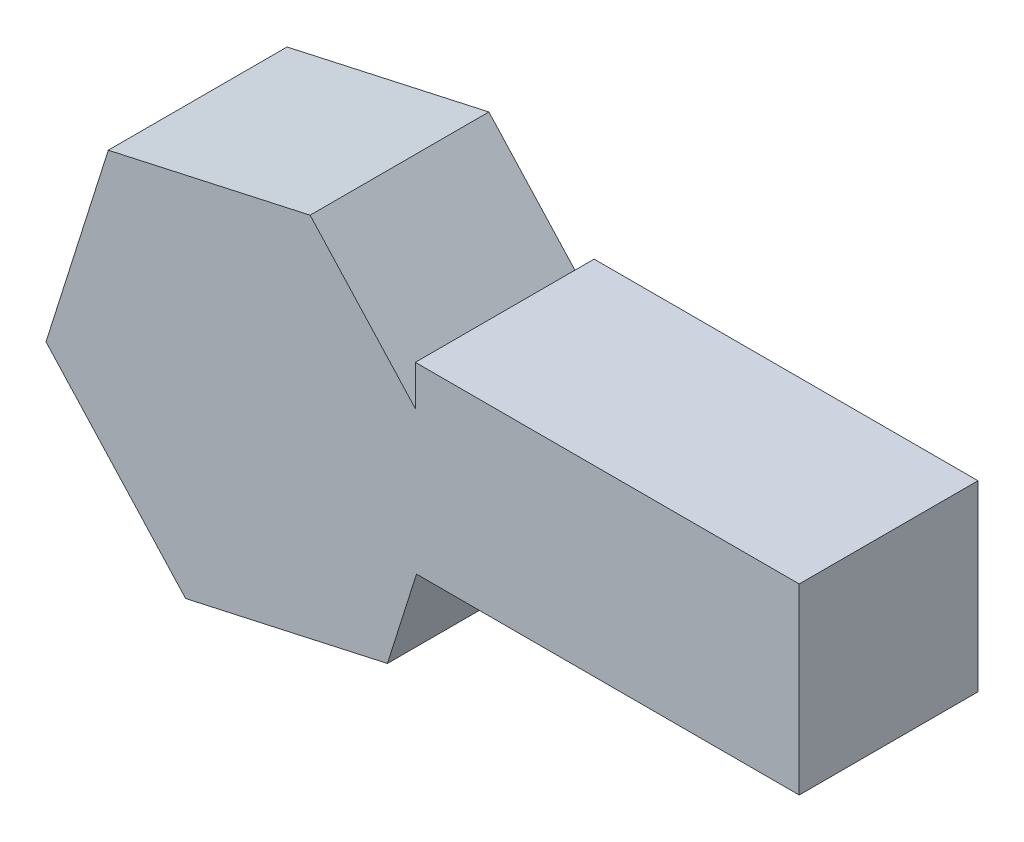
ISO-10303-21;
HEADER;
FILE_DESCRIPTION(('STEP AP214'),'2;1');
FILE_NAME('part.step','',(''),(''),'','','');
FILE_SCHEMA(('AUTOMOTIVE_DESIGN { 1 0 10303 214 1 1 1 1 }'));
ENDSEC;
DATA;
#1=APPLICATION_CONTEXT('core data for automotive mechanical design processes');
#2=APPLICATION_PROTOCOL_DEFINITION('international standard','automotive_design',2000,#1);
#3=PRODUCT_CONTEXT('',#1,'mechanical');
#4=PRODUCT('Part','Part','',(#3));
#5=PRODUCT_RELATED_PRODUCT_CATEGORY('part','',(#4));
#6=PRODUCT_DEFINITION_FORMATION('','',#4);
#7=PRODUCT_DEFINITION_CONTEXT('part definition',#1,'design');
#8=PRODUCT_DEFINITION('design','',#6,#7);
#9=PRODUCT_DEFINITION_SHAPE('','',#8);
#10=(LENGTH_UNIT() NAMED_UNIT(*) SI_UNIT(.MILLI.,.METRE.));
#11=(NAMED_UNIT(*) PLANE_ANGLE_UNIT() SI_UNIT($,.RADIAN.));
#12=(NAMED_UNIT(*) SI_UNIT($,.STERADIAN.) SOLID_ANGLE_UNIT());
#13=UNCERTAINTY_MEASURE_WITH_UNIT(LENGTH_MEASURE(1.E-05),#10,'distance_accuracy_value','');
#14=(GEOMETRIC_REPRESENTATION_CONTEXT(3) GLOBAL_UNCERTAINTY_ASSIGNED_CONTEXT((#13)) GLOBAL_UNIT_ASSIGNED_CONTEXT((#10,
#11,#12)) REPRESENTATION_CONTEXT('',''));
#15=CARTESIAN_POINT('',(0.,0.,0.));
#16=DIRECTION('',(0.,0.,1.));
#17=DIRECTION('',(1.,0.,0.));
#18=AXIS2_PLACEMENT_3D('',#15,#16,#17);
#19=CARTESIAN_POINT('',(-85.7610498689514,27.0933166128518,123.952));
#20=DIRECTION('',(-0.953547922120265,0.301241365386834,0.));
#21=DIRECTION('',(-0.301241365386834,-0.953547922120266,0.));
#22=AXIS2_PLACEMENT_3D('',#19,#20,#21);
#23=PLANE('',#22);
#24=DIRECTION('',(0.301241365386834,0.953547922120265,0.));
#25=VECTOR('',#24,1.);
#26=CARTESIAN_POINT('',(-85.7610498689514,27.0933166128518,0.));
#27=LINE('',#26,#25);
#28=CARTESIAN_POINT('',(-134.237307201379,-126.353187628506,0.));
#29=VERTEX_POINT('',#28);
#30=CARTESIAN_POINT('',(-114.091291890467,-62.5830908024787,0.));
#31=VERTEX_POINT('',#30);
#32=EDGE_CURVE('E145',#29,#31,#27,.T.);
#33=ORIENTED_EDGE('',*,*,#32,.T.);
#34=DIRECTION('',(0.,0.,-1.));
#35=VECTOR('',#34,1.);
#36=CARTESIAN_POINT('',(-114.091291890467,-62.5830908024787,123.952));
#37=LINE('',#36,#35);
#38=CARTESIAN_POINT('',(-114.091291890467,-62.5830908024787,123.952));
#39=VERTEX_POINT('',#38);
#40=EDGE_CURVE('E11',#39,#31,#37,.T.);
#41=ORIENTED_EDGE('',*,*,#40,.F.);
#42=DIRECTION('',(0.301241365386834,0.953547922120265,0.));
#43=VECTOR('',#42,1.);
#44=CARTESIAN_POINT('',(-85.7610498689514,27.0933166128518,123.952));
#45=LINE('',#44,#43);
#46=CARTESIAN_POINT('',(-134.237307201379,-126.353187628506,123.952));
#47=VERTEX_POINT('',#46);
#48=EDGE_CURVE('E166',#47,#39,#45,.T.);
#49=ORIENTED_EDGE('',*,*,#48,.F.);
#50=DIRECTION('',(0.,0.,-1.));
#51=VECTOR('',#50,1.);
#52=CARTESIAN_POINT('',(-134.237307201379,-126.353187628506,123.952));
#53=LINE('',#52,#51);
#54=EDGE_CURVE('E141',#47,#29,#53,.T.);
#55=ORIENTED_EDGE('',*,*,#54,.T.);
#56=EDGE_LOOP('',(#33,#41,#49,#55));
#57=FACE_BOUND('',#56,.T.);
#58=ADVANCED_FACE('F37',(#57),#23,.F.);
#59=CARTESIAN_POINT('',(0.,-62.5830908024787,123.952));
#60=DIRECTION('',(0.,1.,0.));
#61=DIRECTION('',(0.,0.,1.));
#62=AXIS2_PLACEMENT_3D('',#59,#60,#61);
#63=PLANE('',#62);
#64=DIRECTION('',(1.,0.,0.));
#65=VECTOR('',#64,1.);
#66=CARTESIAN_POINT('',(0.,-62.5830908024787,0.));
#67=LINE('',#66,#65);
#68=CARTESIAN_POINT('',(151.26718629983,-62.5830908024787,0.));
#69=VERTEX_POINT('',#68);
#70=EDGE_CURVE('E148',#31,#69,#67,.T.);
#71=ORIENTED_EDGE('',*,*,#70,.T.);
#72=DIRECTION('',(0.,0.,-1.));
#73=VECTOR('',#72,1.);
#74=CARTESIAN_POINT('',(151.26718629983,-62.5830908024787,123.952));
#75=LINE('',#74,#73);
#76=CARTESIAN_POINT('',(151.26718629983,-62.5830908024787,123.952));
#77=VERTEX_POINT('',#76);
#78=EDGE_CURVE('E45',#77,#69,#75,.T.);
#79=ORIENTED_EDGE('',*,*,#78,.F.);
#80=DIRECTION('',(1.,0.,0.));
#81=VECTOR('',#80,1.);
#82=CARTESIAN_POINT('',(0.,-62.5830908024787,123.952));
#83=LINE('',#82,#81);
#84=EDGE_CURVE('E102',#39,#77,#83,.T.);
#85=ORIENTED_EDGE('',*,*,#84,.F.);
#86=ORIENTED_EDGE('',*,*,#40,.T.);
#87=EDGE_LOOP('',(#71,#79,#85,#86));
#88=FACE_BOUND('',#87,.T.);
#89=ADVANCED_FACE('F185',(#88),#63,.F.);
#90=CARTESIAN_POINT('',(151.26718629983,0.,123.952));
#91=DIRECTION('',(1.,0.,0.));
#92=DIRECTION('',(0.,0.,-1.));
#93=AXIS2_PLACEMENT_3D('',#90,#91,#92);
#94=PLANE('',#93);
#95=DIRECTION('',(0.,-1.,0.));
#96=VECTOR('',#95,1.);
#97=CARTESIAN_POINT('',(151.26718629983,0.,0.));
#98=LINE('',#97,#96);
#99=CARTESIAN_POINT('',(151.26718629983,64.1649698748952,0.));
#100=VERTEX_POINT('',#99);
#101=EDGE_CURVE('E151',#100,#69,#98,.T.);
#102=ORIENTED_EDGE('',*,*,#101,.F.);
#103=DIRECTION('',(0.,0.,-1.));
#104=VECTOR('',#103,1.);
#105=CARTESIAN_POINT('',(151.26718629983,64.1649698748952,123.952));
#106=LINE('',#105,#104);
#107=CARTESIAN_POINT('',(151.26718629983,64.1649698748952,123.952));
#108=VERTEX_POINT('',#107);
#109=EDGE_CURVE('E178',#108,#100,#106,.T.);
#110=ORIENTED_EDGE('',*,*,#109,.F.);
#111=DIRECTION('',(0.,-1.,0.));
#112=VECTOR('',#111,1.);
#113=CARTESIAN_POINT('',(151.26718629983,0.,123.952));
#114=LINE('',#113,#112);
#115=EDGE_CURVE('E184',#108,#77,#114,.T.);
#116=ORIENTED_EDGE('',*,*,#115,.T.);
#117=ORIENTED_EDGE('',*,*,#78,.T.);
#118=EDGE_LOOP('',(#102,#110,#116,#117));
#119=FACE_BOUND('',#118,.T.);
#120=ADVANCED_FACE('F182',(#119),#94,.T.);
#121=CARTESIAN_POINT('',(0.,64.1649698748952,123.952));
#122=DIRECTION('',(0.,1.,0.));
#123=DIRECTION('',(0.,0.,1.));
#124=AXIS2_PLACEMENT_3D('',#121,#122,#123);
#125=PLANE('',#124);
#126=DIRECTION('',(1.,0.,0.));
#127=VECTOR('',#126,1.);
#128=CARTESIAN_POINT('',(0.,64.1649698748952,0.));
#129=LINE('',#128,#127);
#130=CARTESIAN_POINT('',(-114.88396763425,64.1649698748952,0.));
#131=VERTEX_POINT('',#130);
#132=EDGE_CURVE('E154',#131,#100,#129,.T.);
#133=ORIENTED_EDGE('',*,*,#132,.F.);
#134=DIRECTION('',(0.,0.,-1.));
#135=VECTOR('',#134,1.);
#136=CARTESIAN_POINT('',(-114.88396763425,64.1649698748952,123.952));
#137=LINE('',#136,#135);
#138=CARTESIAN_POINT('',(-114.88396763425,64.1649698748952,123.952));
#139=VERTEX_POINT('',#138);
#140=EDGE_CURVE('E176',#139,#131,#137,.T.);
#141=ORIENTED_EDGE('',*,*,#140,.F.);
#142=DIRECTION('',(1.,0.,0.));
#143=VECTOR('',#142,1.);
#144=CARTESIAN_POINT('',(0.,64.1649698748952,123.952));
#145=LINE('',#144,#143);
#146=EDGE_CURVE('E198',#139,#108,#145,.T.);
#147=ORIENTED_EDGE('',*,*,#146,.T.);
#148=ORIENTED_EDGE('',*,*,#109,.T.);
#149=EDGE_LOOP('',(#133,#141,#147,#148));
#150=FACE_BOUND('',#149,.T.);
#151=ADVANCED_FACE('F194',(#150),#125,.T.);
#152=CARTESIAN_POINT('',(-114.88396763425,0.,123.952));
#153=DIRECTION('',(1.,0.,0.));
#154=DIRECTION('',(0.,0.,-1.));
#155=AXIS2_PLACEMENT_3D('',#152,#153,#154);
#156=PLANE('',#155);
#157=DIRECTION('',(0.,-1.,0.));
#158=VECTOR('',#157,1.);
#159=CARTESIAN_POINT('',(-114.88396763425,0.,0.));
#160=LINE('',#159,#158);
#161=CARTESIAN_POINT('',(-114.88396763425,36.33988285761,0.));
#162=VERTEX_POINT('',#161);
#163=EDGE_CURVE('E157',#131,#162,#160,.T.);
#164=ORIENTED_EDGE('',*,*,#163,.T.);
#165=DIRECTION('',(0.,0.,-1.));
#166=VECTOR('',#165,1.);
#167=CARTESIAN_POINT('',(-114.88396763425,36.33988285761,123.952));
#168=LINE('',#167,#166);
#169=CARTESIAN_POINT('',(-114.88396763425,36.33988285761,123.952));
#170=VERTEX_POINT('',#169);
#171=EDGE_CURVE('E173',#170,#162,#168,.T.);
#172=ORIENTED_EDGE('',*,*,#171,.F.);
#173=DIRECTION('',(0.,-1.,0.));
#174=VECTOR('',#173,1.);
#175=CARTESIAN_POINT('',(-114.88396763425,0.,123.952));
#176=LINE('',#175,#174);
#177=EDGE_CURVE('E200',#139,#170,#176,.T.);
#178=ORIENTED_EDGE('',*,*,#177,.F.);
#179=ORIENTED_EDGE('',*,*,#140,.T.);
#180=EDGE_LOOP('',(#164,#172,#178,#179));
#181=FACE_BOUND('',#180,.T.);
#182=ADVANCED_FACE('F238',(#181),#156,.F.);
#183=CARTESIAN_POINT('',(-44.4136442770384,-40.6517437323774,123.952));
#184=DIRECTION('',(-0.737656636155842,-0.675176041588598,0.));
#185=DIRECTION('',(0.675176041588598,-0.737656636155842,0.));
#186=AXIS2_PLACEMENT_3D('',#183,#184,#185);
#187=PLANE('',#186);
#188=DIRECTION('',(-0.675176041588598,0.737656636155842,0.));
#189=VECTOR('',#188,1.);
#190=CARTESIAN_POINT('',(-44.4136442770384,-40.6517437323774,0.));
#191=LINE('',#190,#189);
#192=CARTESIAN_POINT('',(-187.831275188932,116.037713042468,0.));
#193=VERTEX_POINT('',#192);
#194=EDGE_CURVE('E159',#162,#193,#191,.T.);
#195=ORIENTED_EDGE('',*,*,#194,.T.);
#196=DIRECTION('',(0.,0.,-1.));
#197=VECTOR('',#196,1.);
#198=CARTESIAN_POINT('',(-187.831275188932,116.037713042468,123.952));
#199=LINE('',#198,#197);
#200=CARTESIAN_POINT('',(-187.831275188932,116.037713042468,123.952));
#201=VERTEX_POINT('',#200);
#202=EDGE_CURVE('E170',#201,#193,#199,.T.);
#203=ORIENTED_EDGE('',*,*,#202,.F.);
#204=DIRECTION('',(-0.675176041588598,0.737656636155842,0.));
#205=VECTOR('',#204,1.);
#206=CARTESIAN_POINT('',(-44.4136442770384,-40.6517437323774,123.952));
#207=LINE('',#206,#205);
#208=EDGE_CURVE('E206',#170,#201,#207,.T.);
#209=ORIENTED_EDGE('',*,*,#208,.F.);
#210=ORIENTED_EDGE('',*,*,#171,.T.);
#211=EDGE_LOOP('',(#195,#203,#209,#210));
#212=FACE_BOUND('',#211,.T.);
#213=ADVANCED_FACE('F211',(#212),#187,.F.);
#214=CARTESIAN_POINT('',(-33.2153878268933,150.2241403989,123.952));
#215=DIRECTION('',(0.215891285964423,-0.976417406975433,0.));
#216=DIRECTION('',(0.976417406975433,0.215891285964423,0.));
#217=AXIS2_PLACEMENT_3D('',#214,#215,#216);
#218=PLANE('',#217);
#219=DIRECTION('',(-0.976417406975433,-0.215891285964423,0.));
#220=VECTOR('',#219,1.);
#221=CARTESIAN_POINT('',(-33.2153878268933,150.2241403989,0.));
#222=LINE('',#221,#220);
#223=CARTESIAN_POINT('',(-327.775726940435,85.0952211979137,0.));
#224=VERTEX_POINT('',#223);
#225=EDGE_CURVE('E161',#193,#224,#222,.T.);
#226=ORIENTED_EDGE('',*,*,#225,.T.);
#227=DIRECTION('',(0.,0.,-1.));
#228=VECTOR('',#227,1.);
#229=CARTESIAN_POINT('',(-327.775726940435,85.0952211979137,123.952));
#230=LINE('',#229,#228);
#231=CARTESIAN_POINT('',(-327.775726940435,85.0952211979137,123.952));
#232=VERTEX_POINT('',#231);
#233=EDGE_CURVE('E136',#232,#224,#230,.T.);
#234=ORIENTED_EDGE('',*,*,#233,.F.);
#235=DIRECTION('',(-0.976417406975433,-0.215891285964423,0.));
#236=VECTOR('',#235,1.);
#237=CARTESIAN_POINT('',(-33.2153878268933,150.2241403989,123.952));
#238=LINE('',#237,#236);
#239=EDGE_CURVE('E127',#201,#232,#238,.T.);
#240=ORIENTED_EDGE('',*,*,#239,.F.);
#241=ORIENTED_EDGE('',*,*,#202,.T.);
#242=EDGE_LOOP('',(#226,#234,#240,#241));
#243=FACE_BOUND('',#242,.T.);
#244=ADVANCED_FACE('F214',(#243),#218,.F.);
#245=CARTESIAN_POINT('',(-322.474711489982,101.875029181508,123.952));
#246=DIRECTION('',(0.953547922120265,-0.301241365386836,0.));
#247=DIRECTION('',(0.301241365386836,0.953547922120265,0.));
#248=AXIS2_PLACEMENT_3D('',#245,#246,#247);
#249=PLANE('',#248);
#250=DIRECTION('',(-0.301241365386836,-0.953547922120265,0.));
#251=VECTOR('',#250,1.);
#252=CARTESIAN_POINT('',(-322.474711489982,101.875029181508,0.));
#253=LINE('',#252,#251);
#254=CARTESIAN_POINT('',(-370.95096882241,-51.5714750598505,0.));
#255=VERTEX_POINT('',#254);
#256=EDGE_CURVE('E135',#224,#255,#253,.T.);
#257=ORIENTED_EDGE('',*,*,#256,.T.);
#258=DIRECTION('',(0.,0.,-1.));
#259=VECTOR('',#258,1.);
#260=CARTESIAN_POINT('',(-370.95096882241,-51.5714750598505,123.952));
#261=LINE('',#260,#259);
#262=CARTESIAN_POINT('',(-370.95096882241,-51.5714750598505,123.952));
#263=VERTEX_POINT('',#262);
#264=EDGE_CURVE('E132',#263,#255,#261,.T.);
#265=ORIENTED_EDGE('',*,*,#264,.F.);
#266=DIRECTION('',(-0.301241365386836,-0.953547922120265,0.));
#267=VECTOR('',#266,1.);
#268=CARTESIAN_POINT('',(-322.474711489982,101.875029181508,123.952));
#269=LINE('',#268,#267);
#270=EDGE_CURVE('E121',#232,#263,#269,.T.);
#271=ORIENTED_EDGE('',*,*,#270,.F.);
#272=ORIENTED_EDGE('',*,*,#233,.T.);
#273=EDGE_LOOP('',(#257,#265,#271,#272));
#274=FACE_BOUND('',#273,.T.);
#275=ADVANCED_FACE('F133',(#274),#249,.F.);
#276=CARTESIAN_POINT('',(-227.533337910516,-208.260931834696,123.952));
#277=DIRECTION('',(0.737656636155843,0.675176041588597,0.));
#278=DIRECTION('',(-0.675176041588597,0.737656636155843,0.));
#279=AXIS2_PLACEMENT_3D('',#276,#277,#278);
#280=PLANE('',#279);
#281=DIRECTION('',(0.675176041588597,-0.737656636155843,0.));
#282=VECTOR('',#281,1.);
#283=CARTESIAN_POINT('',(-227.533337910516,-208.260931834696,0.));
#284=LINE('',#283,#282);
#285=CARTESIAN_POINT('',(-274.181758952882,-157.295679473061,0.));
#286=VERTEX_POINT('',#285);
#287=EDGE_CURVE('E88',#255,#286,#284,.T.);
#288=ORIENTED_EDGE('',*,*,#287,.T.);
#289=DIRECTION('',(0.,0.,-1.));
#290=VECTOR('',#289,1.);
#291=CARTESIAN_POINT('',(-274.181758952882,-157.295679473061,123.952));
#292=LINE('',#291,#290);
#293=CARTESIAN_POINT('',(-274.181758952882,-157.295679473061,123.952));
#294=VERTEX_POINT('',#293);
#295=EDGE_CURVE('E137',#294,#286,#292,.T.);
#296=ORIENTED_EDGE('',*,*,#295,.F.);
#297=DIRECTION('',(0.675176041588597,-0.737656636155843,0.));
#298=VECTOR('',#297,1.);
#299=CARTESIAN_POINT('',(-227.533337910516,-208.260931834696,123.952));
#300=LINE('',#299,#298);
#301=EDGE_CURVE('E125',#263,#294,#300,.T.);
#302=ORIENTED_EDGE('',*,*,#301,.F.);
#303=ORIENTED_EDGE('',*,*,#264,.T.);
#304=EDGE_LOOP('',(#288,#296,#302,#303));
#305=FACE_BOUND('',#304,.T.);
#306=ADVANCED_FACE('F139',(#305),#280,.F.);
#307=CARTESIAN_POINT('',(20.3785801606603,-92.1667602720747,123.952));
#308=DIRECTION('',(-0.215891285964423,0.976417406975433,0.));
#309=DIRECTION('',(-0.976417406975433,-0.215891285964423,0.));
#310=AXIS2_PLACEMENT_3D('',#307,#308,#309);
#311=PLANE('',#310);
#312=DIRECTION('',(0.976417406975433,0.215891285964423,0.));
#313=VECTOR('',#312,1.);
#314=CARTESIAN_POINT('',(20.3785801606603,-92.1667602720747,0.));
#315=LINE('',#314,#313);
#316=EDGE_CURVE('E94',#286,#29,#315,.T.);
#317=ORIENTED_EDGE('',*,*,#316,.T.);
#318=ORIENTED_EDGE('',*,*,#54,.F.);
#319=DIRECTION('',(0.976417406975433,0.215891285964423,0.));
#320=VECTOR('',#319,1.);
#321=CARTESIAN_POINT('',(20.3785801606603,-92.1667602720747,123.952));
#322=LINE('',#321,#320);
#323=EDGE_CURVE('E53',#294,#47,#322,.T.);
#324=ORIENTED_EDGE('',*,*,#323,.F.);
#325=ORIENTED_EDGE('',*,*,#295,.T.);
#326=EDGE_LOOP('',(#317,#318,#324,#325));
#327=FACE_BOUND('',#326,.T.);
#328=ADVANCED_FACE('F217',(#327),#311,.F.);
#329=CARTESIAN_POINT('',(0.,0.,123.952));
#330=DIRECTION('',(0.,0.,1.));
#331=DIRECTION('',(1.,0.,0.));
#332=AXIS2_PLACEMENT_3D('',#329,#330,#331);
#333=PLANE('',#332);
#334=ORIENTED_EDGE('',*,*,#48,.T.);
#335=ORIENTED_EDGE('',*,*,#84,.T.);
#336=ORIENTED_EDGE('',*,*,#115,.F.);
#337=ORIENTED_EDGE('',*,*,#146,.F.);
#338=ORIENTED_EDGE('',*,*,#177,.T.);
#339=ORIENTED_EDGE('',*,*,#208,.T.);
#340=ORIENTED_EDGE('',*,*,#239,.T.);
#341=ORIENTED_EDGE('',*,*,#270,.T.);
#342=ORIENTED_EDGE('',*,*,#301,.T.);
#343=ORIENTED_EDGE('',*,*,#323,.T.);
#344=EDGE_LOOP('',(#334,#335,#336,#337,#338,#339,#340,#341,#342,#343));
#345=FACE_BOUND('',#344,.T.);
#346=ADVANCED_FACE('F123',(#345),#333,.T.);
#347=CARTESIAN_POINT('',(0.,0.,0.));
#348=DIRECTION('',(0.,0.,1.));
#349=DIRECTION('',(1.,0.,0.));
#350=AXIS2_PLACEMENT_3D('',#347,#348,#349);
#351=PLANE('',#350);
#352=ORIENTED_EDGE('',*,*,#32,.F.);
#353=ORIENTED_EDGE('',*,*,#316,.F.);
#354=ORIENTED_EDGE('',*,*,#287,.F.);
#355=ORIENTED_EDGE('',*,*,#256,.F.);
#356=ORIENTED_EDGE('',*,*,#225,.F.);
#357=ORIENTED_EDGE('',*,*,#194,.F.);
#358=ORIENTED_EDGE('',*,*,#163,.F.);
#359=ORIENTED_EDGE('',*,*,#132,.T.);
#360=ORIENTED_EDGE('',*,*,#101,.T.);
#361=ORIENTED_EDGE('',*,*,#70,.F.);
#362=EDGE_LOOP('',(#352,#353,#354,#355,#356,#357,#358,#359,#360,#361));
#363=FACE_BOUND('',#362,.T.);
#364=ADVANCED_FACE('F189',(#363),#351,.F.);
#365=CLOSED_SHELL('',(#58,#89,#120,#151,#182,#213,#244,#275,#306,#328,#346,#364));
#366=MANIFOLD_SOLID_BREP('B2',#365);
#367=ADVANCED_BREP_SHAPE_REPRESENTATION('',(#18,#366),#14);
#368=SHAPE_DEFINITION_REPRESENTATION(#9,#367);
ENDSEC;
END-ISO-10303-21;
